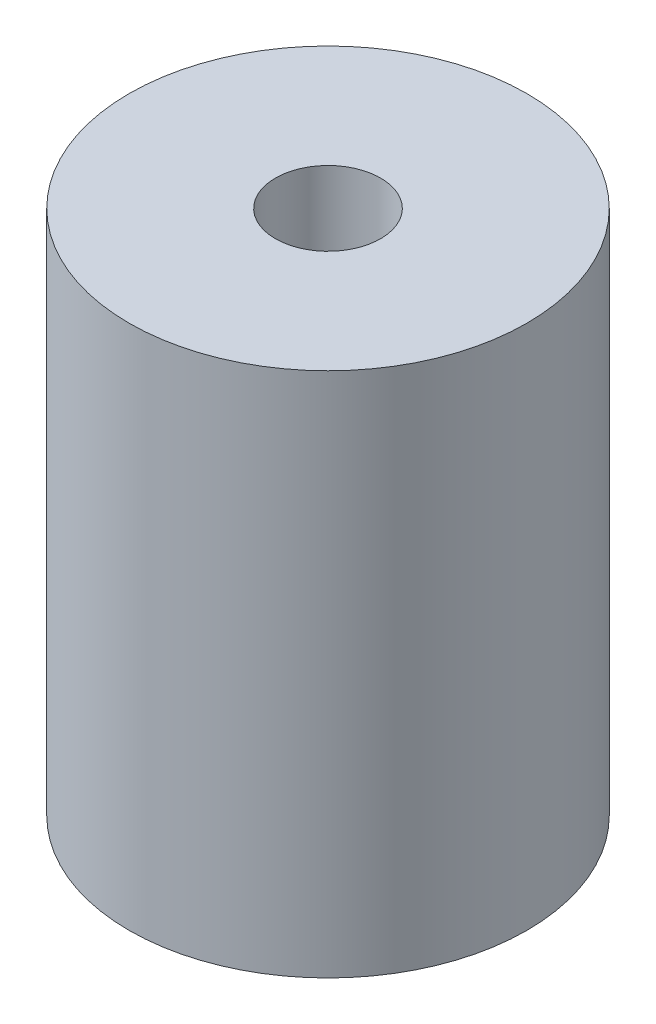
ISO-10303-21;
HEADER;
FILE_DESCRIPTION(('STEP AP214'),'2;1');
FILE_NAME('part.step','',(''),(''),'','','');
FILE_SCHEMA(('AUTOMOTIVE_DESIGN { 1 0 10303 214 1 1 1 1 }'));
ENDSEC;
DATA;
#1=APPLICATION_CONTEXT('core data for automotive mechanical design processes');
#2=APPLICATION_PROTOCOL_DEFINITION('international standard','automotive_design',2000,#1);
#3=PRODUCT_CONTEXT('',#1,'mechanical');
#4=PRODUCT('Part','Part','',(#3));
#5=PRODUCT_RELATED_PRODUCT_CATEGORY('part','',(#4));
#6=PRODUCT_DEFINITION_FORMATION('','',#4);
#7=PRODUCT_DEFINITION_CONTEXT('part definition',#1,'design');
#8=PRODUCT_DEFINITION('design','',#6,#7);
#9=PRODUCT_DEFINITION_SHAPE('','',#8);
#10=(LENGTH_UNIT() NAMED_UNIT(*) SI_UNIT(.MILLI.,.METRE.));
#11=(NAMED_UNIT(*) PLANE_ANGLE_UNIT() SI_UNIT($,.RADIAN.));
#12=(NAMED_UNIT(*) SI_UNIT($,.STERADIAN.) SOLID_ANGLE_UNIT());
#13=UNCERTAINTY_MEASURE_WITH_UNIT(LENGTH_MEASURE(1.E-05),#10,'distance_accuracy_value','');
#14=(GEOMETRIC_REPRESENTATION_CONTEXT(3) GLOBAL_UNCERTAINTY_ASSIGNED_CONTEXT((#13)) GLOBAL_UNIT_ASSIGNED_CONTEXT((#10,
#11,#12)) REPRESENTATION_CONTEXT('',''));
#15=CARTESIAN_POINT('',(0.,0.,0.));
#16=DIRECTION('',(0.,0.,1.));
#17=DIRECTION('',(1.,0.,0.));
#18=AXIS2_PLACEMENT_3D('',#15,#16,#17);
#19=CARTESIAN_POINT('',(0.,25.,0.));
#20=DIRECTION('',(0.,-1.,0.));
#21=DIRECTION('',(0.,0.,-1.));
#22=AXIS2_PLACEMENT_3D('',#19,#20,#21);
#23=CYLINDRICAL_SURFACE('',#22,2.5);
#24=CARTESIAN_POINT('',(0.,0.,0.));
#25=DIRECTION('',(0.,1.,0.));
#26=DIRECTION('',(0.,0.,1.));
#27=AXIS2_PLACEMENT_3D('',#24,#25,#26);
#28=CIRCLE('',#27,2.5);
#29=CARTESIAN_POINT('',(0.,0.,2.5));
#30=VERTEX_POINT('',#29);
#31=EDGE_CURVE('E65',#30,#30,#28,.T.);
#32=ORIENTED_EDGE('',*,*,#31,.F.);
#33=EDGE_LOOP('',(#32));
#34=FACE_BOUND('',#33,.T.);
#35=CARTESIAN_POINT('',(0.,7.,0.));
#36=DIRECTION('',(0.,1.,0.));
#37=DIRECTION('',(0.,0.,1.));
#38=AXIS2_PLACEMENT_3D('',#35,#36,#37);
#39=CIRCLE('',#38,2.5);
#40=CARTESIAN_POINT('',(0.,7.,2.5));
#41=VERTEX_POINT('',#40);
#42=EDGE_CURVE('E68',#41,#41,#39,.F.);
#43=ORIENTED_EDGE('',*,*,#42,.F.);
#44=EDGE_LOOP('',(#43));
#45=FACE_BOUND('',#44,.T.);
#46=ADVANCED_FACE('F47',(#34,#45),#23,.F.);
#47=CARTESIAN_POINT('',(0.,25.,0.));
#48=DIRECTION('',(0.,1.,0.));
#49=DIRECTION('',(0.,0.,1.));
#50=AXIS2_PLACEMENT_3D('',#47,#48,#49);
#51=PLANE('',#50);
#52=CARTESIAN_POINT('',(0.,25.,0.));
#53=DIRECTION('',(0.,1.,0.));
#54=DIRECTION('',(0.,0.,1.));
#55=AXIS2_PLACEMENT_3D('',#52,#53,#54);
#56=CIRCLE('',#55,9.455);
#57=CARTESIAN_POINT('',(0.,25.,9.455));
#58=VERTEX_POINT('',#57);
#59=EDGE_CURVE('E54',#58,#58,#56,.T.);
#60=ORIENTED_EDGE('',*,*,#59,.T.);
#61=EDGE_LOOP('',(#60));
#62=FACE_BOUND('',#61,.T.);
#63=CARTESIAN_POINT('',(0.,25.,0.));
#64=DIRECTION('',(0.,1.,0.));
#65=DIRECTION('',(0.,0.,1.));
#66=AXIS2_PLACEMENT_3D('',#63,#64,#65);
#67=CIRCLE('',#66,2.5);
#68=CARTESIAN_POINT('',(0.,25.,2.5));
#69=VERTEX_POINT('',#68);
#70=EDGE_CURVE('E63',#69,#69,#67,.T.);
#71=ORIENTED_EDGE('',*,*,#70,.F.);
#72=EDGE_LOOP('',(#71));
#73=FACE_BOUND('',#72,.T.);
#74=ADVANCED_FACE('F77',(#62,#73),#51,.T.);
#75=CARTESIAN_POINT('',(0.,0.,0.));
#76=DIRECTION('',(0.,1.,0.));
#77=DIRECTION('',(0.,0.,1.));
#78=AXIS2_PLACEMENT_3D('',#75,#76,#77);
#79=PLANE('',#78);
#80=CARTESIAN_POINT('',(0.,0.,0.));
#81=DIRECTION('',(0.,1.,0.));
#82=DIRECTION('',(0.,0.,1.));
#83=AXIS2_PLACEMENT_3D('',#80,#81,#82);
#84=CIRCLE('',#83,9.455);
#85=CARTESIAN_POINT('',(0.,0.,9.455));
#86=VERTEX_POINT('',#85);
#87=EDGE_CURVE('E58',#86,#86,#84,.T.);
#88=ORIENTED_EDGE('',*,*,#87,.F.);
#89=EDGE_LOOP('',(#88));
#90=FACE_BOUND('',#89,.T.);
#91=ORIENTED_EDGE('',*,*,#31,.T.);
#92=EDGE_LOOP('',(#91));
#93=FACE_BOUND('',#92,.T.);
#94=ADVANCED_FACE('F84',(#90,#93),#79,.F.);
#95=CARTESIAN_POINT('',(0.,25.,0.));
#96=DIRECTION('',(0.,-1.,0.));
#97=DIRECTION('',(0.,0.,-1.));
#98=AXIS2_PLACEMENT_3D('',#95,#96,#97);
#99=CYLINDRICAL_SURFACE('',#98,9.455);
#100=ORIENTED_EDGE('',*,*,#59,.F.);
#101=EDGE_LOOP('',(#100));
#102=FACE_BOUND('',#101,.T.);
#103=ORIENTED_EDGE('',*,*,#87,.T.);
#104=EDGE_LOOP('',(#103));
#105=FACE_BOUND('',#104,.T.);
#106=ADVANCED_FACE('F49',(#102,#105),#99,.T.);
#107=CARTESIAN_POINT('',(0.,18.,0.));
#108=DIRECTION('',(0.,1.,0.));
#109=DIRECTION('',(0.,0.,1.));
#110=AXIS2_PLACEMENT_3D('',#107,#108,#109);
#111=CIRCLE('',#110,2.5);
#112=CARTESIAN_POINT('',(0.,18.,2.5));
#113=VERTEX_POINT('',#112);
#114=EDGE_CURVE('E13',#113,#113,#111,.T.);
#115=ORIENTED_EDGE('',*,*,#114,.F.);
#116=EDGE_LOOP('',(#115));
#117=FACE_BOUND('',#116,.T.);
#118=ORIENTED_EDGE('',*,*,#70,.T.);
#119=EDGE_LOOP('',(#118));
#120=FACE_BOUND('',#119,.T.);
#121=ADVANCED_FACE('F80',(#117,#120),#23,.F.);
#122=CARTESIAN_POINT('',(0.,7.,0.));
#123=DIRECTION('',(0.,1.,0.));
#124=DIRECTION('',(0.,0.,1.));
#125=AXIS2_PLACEMENT_3D('',#122,#123,#124);
#126=PLANE('',#125);
#127=ORIENTED_EDGE('',*,*,#42,.T.);
#128=EDGE_LOOP('',(#127));
#129=FACE_BOUND('',#128,.T.);
#130=ADVANCED_FACE('F74',(#129),#126,.F.);
#131=CARTESIAN_POINT('',(0.,18.,0.));
#132=DIRECTION('',(0.,1.,0.));
#133=DIRECTION('',(0.,0.,1.));
#134=AXIS2_PLACEMENT_3D('',#131,#132,#133);
#135=PLANE('',#134);
#136=ORIENTED_EDGE('',*,*,#114,.T.);
#137=EDGE_LOOP('',(#136));
#138=FACE_BOUND('',#137,.T.);
#139=ADVANCED_FACE('F94',(#138),#135,.T.);
#140=CLOSED_SHELL('',(#46,#74,#94,#106,#121,#130,#139));
#141=MANIFOLD_SOLID_BREP('B2',#140);
#142=ADVANCED_BREP_SHAPE_REPRESENTATION('',(#18,#141),#14);
#143=SHAPE_DEFINITION_REPRESENTATION(#9,#142);
ENDSEC;
END-ISO-10303-21;
